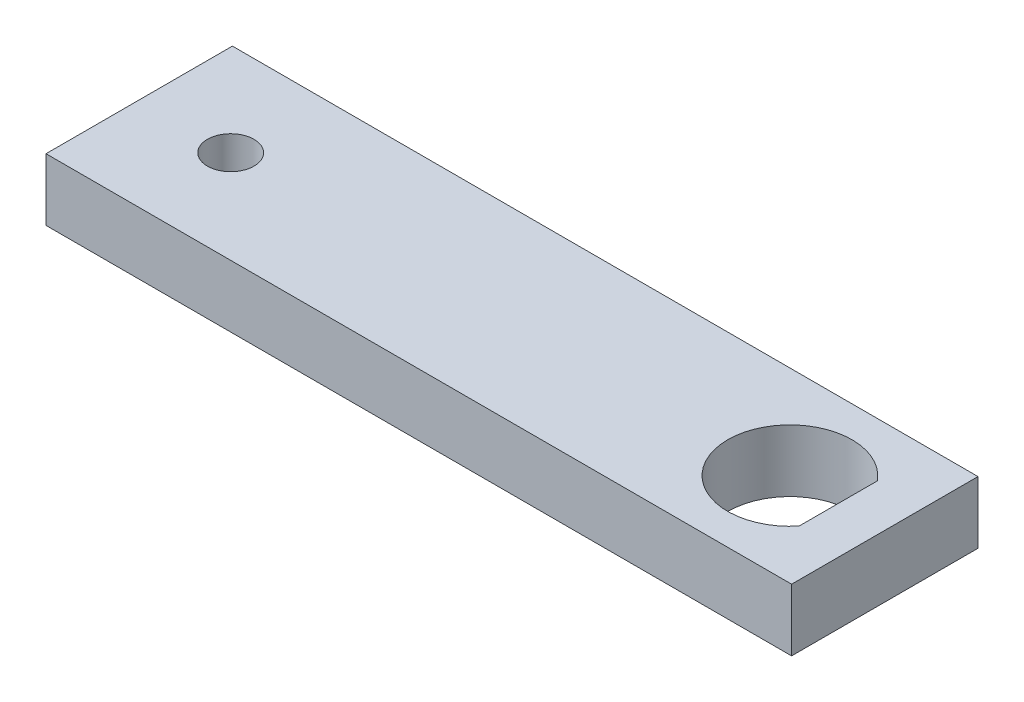
ISO-10303-21;
HEADER;
FILE_DESCRIPTION(('STEP AP214'),'2;1');
FILE_NAME('part.step','',(''),(''),'','','');
FILE_SCHEMA(('AUTOMOTIVE_DESIGN { 1 0 10303 214 1 1 1 1 }'));
ENDSEC;
DATA;
#1=APPLICATION_CONTEXT('core data for automotive mechanical design processes');
#2=APPLICATION_PROTOCOL_DEFINITION('international standard','automotive_design',2000,#1);
#3=PRODUCT_CONTEXT('',#1,'mechanical');
#4=PRODUCT('Part','Part','',(#3));
#5=PRODUCT_RELATED_PRODUCT_CATEGORY('part','',(#4));
#6=PRODUCT_DEFINITION_FORMATION('','',#4);
#7=PRODUCT_DEFINITION_CONTEXT('part definition',#1,'design');
#8=PRODUCT_DEFINITION('design','',#6,#7);
#9=PRODUCT_DEFINITION_SHAPE('','',#8);
#10=(LENGTH_UNIT() NAMED_UNIT(*) SI_UNIT(.MILLI.,.METRE.));
#11=(NAMED_UNIT(*) PLANE_ANGLE_UNIT() SI_UNIT($,.RADIAN.));
#12=(NAMED_UNIT(*) SI_UNIT($,.STERADIAN.) SOLID_ANGLE_UNIT());
#13=UNCERTAINTY_MEASURE_WITH_UNIT(LENGTH_MEASURE(1.E-05),#10,'distance_accuracy_value','');
#14=(GEOMETRIC_REPRESENTATION_CONTEXT(3) GLOBAL_UNCERTAINTY_ASSIGNED_CONTEXT((#13)) GLOBAL_UNIT_ASSIGNED_CONTEXT((#10,
#11,#12)) REPRESENTATION_CONTEXT('',''));
#15=CARTESIAN_POINT('',(0.,0.,0.));
#16=DIRECTION('',(0.,0.,1.));
#17=DIRECTION('',(1.,0.,0.));
#18=AXIS2_PLACEMENT_3D('',#15,#16,#17);
#19=CARTESIAN_POINT('',(0.,6.35,0.));
#20=DIRECTION('',(0.,1.,0.));
#21=DIRECTION('',(0.,0.,1.));
#22=AXIS2_PLACEMENT_3D('',#19,#20,#21);
#23=PLANE('',#22);
#24=DIRECTION('',(0.,0.,1.));
#25=VECTOR('',#24,1.);
#26=CARTESIAN_POINT('',(-38.1,6.35,9.52500000000001));
#27=LINE('',#26,#25);
#28=CARTESIAN_POINT('',(-38.1,6.35,-9.525));
#29=VERTEX_POINT('',#28);
#30=CARTESIAN_POINT('',(-38.1,6.35,9.52500000000001));
#31=VERTEX_POINT('',#30);
#32=EDGE_CURVE('E108',#29,#31,#27,.T.);
#33=ORIENTED_EDGE('',*,*,#32,.T.);
#34=DIRECTION('',(1.,0.,0.));
#35=VECTOR('',#34,1.);
#36=CARTESIAN_POINT('',(38.1,6.35,9.525));
#37=LINE('',#36,#35);
#38=CARTESIAN_POINT('',(38.1,6.35,9.525));
#39=VERTEX_POINT('',#38);
#40=EDGE_CURVE('E111',#31,#39,#37,.T.);
#41=ORIENTED_EDGE('',*,*,#40,.T.);
#42=DIRECTION('',(0.,0.,-1.));
#43=VECTOR('',#42,1.);
#44=CARTESIAN_POINT('',(38.1,6.35,9.525));
#45=LINE('',#44,#43);
#46=CARTESIAN_POINT('',(38.1,6.35,-9.52500000000001));
#47=VERTEX_POINT('',#46);
#48=EDGE_CURVE('E114',#39,#47,#45,.T.);
#49=ORIENTED_EDGE('',*,*,#48,.T.);
#50=DIRECTION('',(-1.,0.,0.));
#51=VECTOR('',#50,1.);
#52=CARTESIAN_POINT('',(38.1,6.35,-9.52500000000001));
#53=LINE('',#52,#51);
#54=EDGE_CURVE('E116',#47,#29,#53,.T.);
#55=ORIENTED_EDGE('',*,*,#54,.T.);
#56=EDGE_LOOP('',(#33,#41,#49,#55));
#57=FACE_BOUND('',#56,.T.);
#58=CARTESIAN_POINT('',(-28.75,6.35,0.));
#59=DIRECTION('',(0.,1.,0.));
#60=DIRECTION('',(0.,0.,1.));
#61=AXIS2_PLACEMENT_3D('',#58,#59,#60);
#62=CIRCLE('',#61,2.38);
#63=CARTESIAN_POINT('',(-28.75,6.35,2.38));
#64=VERTEX_POINT('',#63);
#65=EDGE_CURVE('E102',#64,#64,#62,.T.);
#66=ORIENTED_EDGE('',*,*,#65,.F.);
#67=EDGE_LOOP('',(#66));
#68=FACE_BOUND('',#67,.T.);
#69=DIRECTION('',(0.,0.,-1.));
#70=VECTOR('',#69,1.);
#71=CARTESIAN_POINT('',(33.34,6.35,-3.98984962122634));
#72=LINE('',#71,#70);
#73=CARTESIAN_POINT('',(33.34,6.35,3.98984962122634));
#74=VERTEX_POINT('',#73);
#75=CARTESIAN_POINT('',(33.34,6.35,-3.98984962122634));
#76=VERTEX_POINT('',#75);
#77=EDGE_CURVE('E85',#74,#76,#72,.T.);
#78=ORIENTED_EDGE('',*,*,#77,.F.);
#79=CARTESIAN_POINT('',(28.4,6.35,0.));
#80=DIRECTION('',(0.,1.,0.));
#81=DIRECTION('',(0.,0.,1.));
#82=AXIS2_PLACEMENT_3D('',#79,#80,#81);
#83=CIRCLE('',#82,6.35);
#84=EDGE_CURVE('E91',#76,#74,#83,.T.);
#85=ORIENTED_EDGE('',*,*,#84,.F.);
#86=EDGE_LOOP('',(#78,#85));
#87=FACE_BOUND('',#86,.T.);
#88=ADVANCED_FACE('F33',(#57,#68,#87),#23,.T.);
#89=CARTESIAN_POINT('',(0.,0.,0.));
#90=DIRECTION('',(0.,1.,0.));
#91=DIRECTION('',(0.,0.,1.));
#92=AXIS2_PLACEMENT_3D('',#89,#90,#91);
#93=PLANE('',#92);
#94=CARTESIAN_POINT('',(-28.75,0.,0.));
#95=DIRECTION('',(0.,1.,0.));
#96=DIRECTION('',(0.,0.,1.));
#97=AXIS2_PLACEMENT_3D('',#94,#95,#96);
#98=CIRCLE('',#97,2.38);
#99=CARTESIAN_POINT('',(-28.75,0.,2.38));
#100=VERTEX_POINT('',#99);
#101=EDGE_CURVE('E101',#100,#100,#98,.T.);
#102=ORIENTED_EDGE('',*,*,#101,.T.);
#103=EDGE_LOOP('',(#102));
#104=FACE_BOUND('',#103,.T.);
#105=DIRECTION('',(0.,0.,1.));
#106=VECTOR('',#105,1.);
#107=CARTESIAN_POINT('',(-38.1,0.,9.52500000000001));
#108=LINE('',#107,#106);
#109=CARTESIAN_POINT('',(-38.1,0.,-9.525));
#110=VERTEX_POINT('',#109);
#111=CARTESIAN_POINT('',(-38.1,0.,9.52500000000001));
#112=VERTEX_POINT('',#111);
#113=EDGE_CURVE('E105',#110,#112,#108,.T.);
#114=ORIENTED_EDGE('',*,*,#113,.F.);
#115=DIRECTION('',(-1.,0.,0.));
#116=VECTOR('',#115,1.);
#117=CARTESIAN_POINT('',(38.1,0.,-9.52500000000001));
#118=LINE('',#117,#116);
#119=CARTESIAN_POINT('',(38.1,0.,-9.52500000000001));
#120=VERTEX_POINT('',#119);
#121=EDGE_CURVE('E112',#120,#110,#118,.T.);
#122=ORIENTED_EDGE('',*,*,#121,.F.);
#123=DIRECTION('',(0.,0.,-1.));
#124=VECTOR('',#123,1.);
#125=CARTESIAN_POINT('',(38.1,0.,9.525));
#126=LINE('',#125,#124);
#127=CARTESIAN_POINT('',(38.1,0.,9.525));
#128=VERTEX_POINT('',#127);
#129=EDGE_CURVE('E123',#128,#120,#126,.T.);
#130=ORIENTED_EDGE('',*,*,#129,.F.);
#131=DIRECTION('',(1.,0.,0.));
#132=VECTOR('',#131,1.);
#133=CARTESIAN_POINT('',(38.1,0.,9.525));
#134=LINE('',#133,#132);
#135=EDGE_CURVE('E121',#112,#128,#134,.T.);
#136=ORIENTED_EDGE('',*,*,#135,.F.);
#137=EDGE_LOOP('',(#114,#122,#130,#136));
#138=FACE_BOUND('',#137,.T.);
#139=CARTESIAN_POINT('',(28.4,0.,0.));
#140=DIRECTION('',(0.,1.,0.));
#141=DIRECTION('',(0.,0.,1.));
#142=AXIS2_PLACEMENT_3D('',#139,#140,#141);
#143=CIRCLE('',#142,6.35);
#144=CARTESIAN_POINT('',(33.34,0.,-3.98984962122634));
#145=VERTEX_POINT('',#144);
#146=CARTESIAN_POINT('',(33.34,0.,3.98984962122634));
#147=VERTEX_POINT('',#146);
#148=EDGE_CURVE('E55',#145,#147,#143,.T.);
#149=ORIENTED_EDGE('',*,*,#148,.T.);
#150=DIRECTION('',(0.,0.,-1.));
#151=VECTOR('',#150,1.);
#152=CARTESIAN_POINT('',(33.34,0.,-3.98984962122634));
#153=LINE('',#152,#151);
#154=EDGE_CURVE('E95',#147,#145,#153,.T.);
#155=ORIENTED_EDGE('',*,*,#154,.T.);
#156=EDGE_LOOP('',(#149,#155));
#157=FACE_BOUND('',#156,.T.);
#158=ADVANCED_FACE('F141',(#104,#138,#157),#93,.F.);
#159=CARTESIAN_POINT('',(-38.1,6.35,9.52500000000001));
#160=DIRECTION('',(1.,0.,0.));
#161=DIRECTION('',(0.,0.,-1.));
#162=AXIS2_PLACEMENT_3D('',#159,#160,#161);
#163=PLANE('',#162);
#164=ORIENTED_EDGE('',*,*,#113,.T.);
#165=DIRECTION('',(0.,-1.,0.));
#166=VECTOR('',#165,1.);
#167=CARTESIAN_POINT('',(-38.1,6.35,9.52500000000001));
#168=LINE('',#167,#166);
#169=EDGE_CURVE('E11',#31,#112,#168,.T.);
#170=ORIENTED_EDGE('',*,*,#169,.F.);
#171=ORIENTED_EDGE('',*,*,#32,.F.);
#172=DIRECTION('',(0.,-1.,0.));
#173=VECTOR('',#172,1.);
#174=CARTESIAN_POINT('',(-38.1,6.35,-9.525));
#175=LINE('',#174,#173);
#176=EDGE_CURVE('E118',#29,#110,#175,.T.);
#177=ORIENTED_EDGE('',*,*,#176,.T.);
#178=EDGE_LOOP('',(#164,#170,#171,#177));
#179=FACE_BOUND('',#178,.T.);
#180=ADVANCED_FACE('F35',(#179),#163,.F.);
#181=CARTESIAN_POINT('',(38.1,6.35,9.525));
#182=DIRECTION('',(0.,0.,-1.));
#183=DIRECTION('',(-1.,0.,0.));
#184=AXIS2_PLACEMENT_3D('',#181,#182,#183);
#185=PLANE('',#184);
#186=ORIENTED_EDGE('',*,*,#135,.T.);
#187=DIRECTION('',(0.,-1.,0.));
#188=VECTOR('',#187,1.);
#189=CARTESIAN_POINT('',(38.1,6.35,9.525));
#190=LINE('',#189,#188);
#191=EDGE_CURVE('E41',#39,#128,#190,.T.);
#192=ORIENTED_EDGE('',*,*,#191,.F.);
#193=ORIENTED_EDGE('',*,*,#40,.F.);
#194=ORIENTED_EDGE('',*,*,#169,.T.);
#195=EDGE_LOOP('',(#186,#192,#193,#194));
#196=FACE_BOUND('',#195,.T.);
#197=ADVANCED_FACE('F152',(#196),#185,.F.);
#198=CARTESIAN_POINT('',(38.1,6.35,9.525));
#199=DIRECTION('',(-1.,0.,0.));
#200=DIRECTION('',(0.,0.,1.));
#201=AXIS2_PLACEMENT_3D('',#198,#199,#200);
#202=PLANE('',#201);
#203=ORIENTED_EDGE('',*,*,#129,.T.);
#204=DIRECTION('',(0.,-1.,0.));
#205=VECTOR('',#204,1.);
#206=CARTESIAN_POINT('',(38.1,6.35,-9.52500000000001));
#207=LINE('',#206,#205);
#208=EDGE_CURVE('E128',#47,#120,#207,.T.);
#209=ORIENTED_EDGE('',*,*,#208,.F.);
#210=ORIENTED_EDGE('',*,*,#48,.F.);
#211=ORIENTED_EDGE('',*,*,#191,.T.);
#212=EDGE_LOOP('',(#203,#209,#210,#211));
#213=FACE_BOUND('',#212,.T.);
#214=ADVANCED_FACE('F135',(#213),#202,.F.);
#215=CARTESIAN_POINT('',(38.1,6.35,-9.52500000000001));
#216=DIRECTION('',(0.,0.,1.));
#217=DIRECTION('',(1.,0.,0.));
#218=AXIS2_PLACEMENT_3D('',#215,#216,#217);
#219=PLANE('',#218);
#220=ORIENTED_EDGE('',*,*,#121,.T.);
#221=ORIENTED_EDGE('',*,*,#176,.F.);
#222=ORIENTED_EDGE('',*,*,#54,.F.);
#223=ORIENTED_EDGE('',*,*,#208,.T.);
#224=EDGE_LOOP('',(#220,#221,#222,#223));
#225=FACE_BOUND('',#224,.T.);
#226=ADVANCED_FACE('F145',(#225),#219,.F.);
#227=CARTESIAN_POINT('',(-28.75,6.35,0.));
#228=DIRECTION('',(0.,-1.,0.));
#229=DIRECTION('',(0.,0.,-1.));
#230=AXIS2_PLACEMENT_3D('',#227,#228,#229);
#231=CYLINDRICAL_SURFACE('',#230,2.38);
#232=ORIENTED_EDGE('',*,*,#65,.T.);
#233=EDGE_LOOP('',(#232));
#234=FACE_BOUND('',#233,.T.);
#235=ORIENTED_EDGE('',*,*,#101,.F.);
#236=EDGE_LOOP('',(#235));
#237=FACE_BOUND('',#236,.T.);
#238=ADVANCED_FACE('F167',(#234,#237),#231,.F.);
#239=CARTESIAN_POINT('',(28.4,6.35,0.));
#240=DIRECTION('',(0.,-1.,0.));
#241=DIRECTION('',(0.,0.,-1.));
#242=AXIS2_PLACEMENT_3D('',#239,#240,#241);
#243=CYLINDRICAL_SURFACE('',#242,6.35);
#244=ORIENTED_EDGE('',*,*,#148,.F.);
#245=DIRECTION('',(0.,-1.,0.));
#246=VECTOR('',#245,1.);
#247=CARTESIAN_POINT('',(33.34,6.35,-3.98984962122634));
#248=LINE('',#247,#246);
#249=EDGE_CURVE('E87',#76,#145,#248,.T.);
#250=ORIENTED_EDGE('',*,*,#249,.F.);
#251=ORIENTED_EDGE('',*,*,#84,.T.);
#252=DIRECTION('',(0.,-1.,0.));
#253=VECTOR('',#252,1.);
#254=CARTESIAN_POINT('',(33.34,6.35,3.98984962122634));
#255=LINE('',#254,#253);
#256=EDGE_CURVE('E48',#74,#147,#255,.T.);
#257=ORIENTED_EDGE('',*,*,#256,.T.);
#258=EDGE_LOOP('',(#244,#250,#251,#257));
#259=FACE_BOUND('',#258,.T.);
#260=ADVANCED_FACE('F93',(#259),#243,.F.);
#261=CARTESIAN_POINT('',(33.34,6.35,-3.98984962122634));
#262=DIRECTION('',(-1.,0.,0.));
#263=DIRECTION('',(0.,0.,1.));
#264=AXIS2_PLACEMENT_3D('',#261,#262,#263);
#265=PLANE('',#264);
#266=ORIENTED_EDGE('',*,*,#154,.F.);
#267=ORIENTED_EDGE('',*,*,#256,.F.);
#268=ORIENTED_EDGE('',*,*,#77,.T.);
#269=ORIENTED_EDGE('',*,*,#249,.T.);
#270=EDGE_LOOP('',(#266,#267,#268,#269));
#271=FACE_BOUND('',#270,.T.);
#272=ADVANCED_FACE('F86',(#271),#265,.T.);
#273=CLOSED_SHELL('',(#88,#158,#180,#197,#214,#226,#238,#260,#272));
#274=MANIFOLD_SOLID_BREP('B2',#273);
#275=ADVANCED_BREP_SHAPE_REPRESENTATION('',(#18,#274),#14);
#276=SHAPE_DEFINITION_REPRESENTATION(#9,#275);
ENDSEC;
END-ISO-10303-21;
